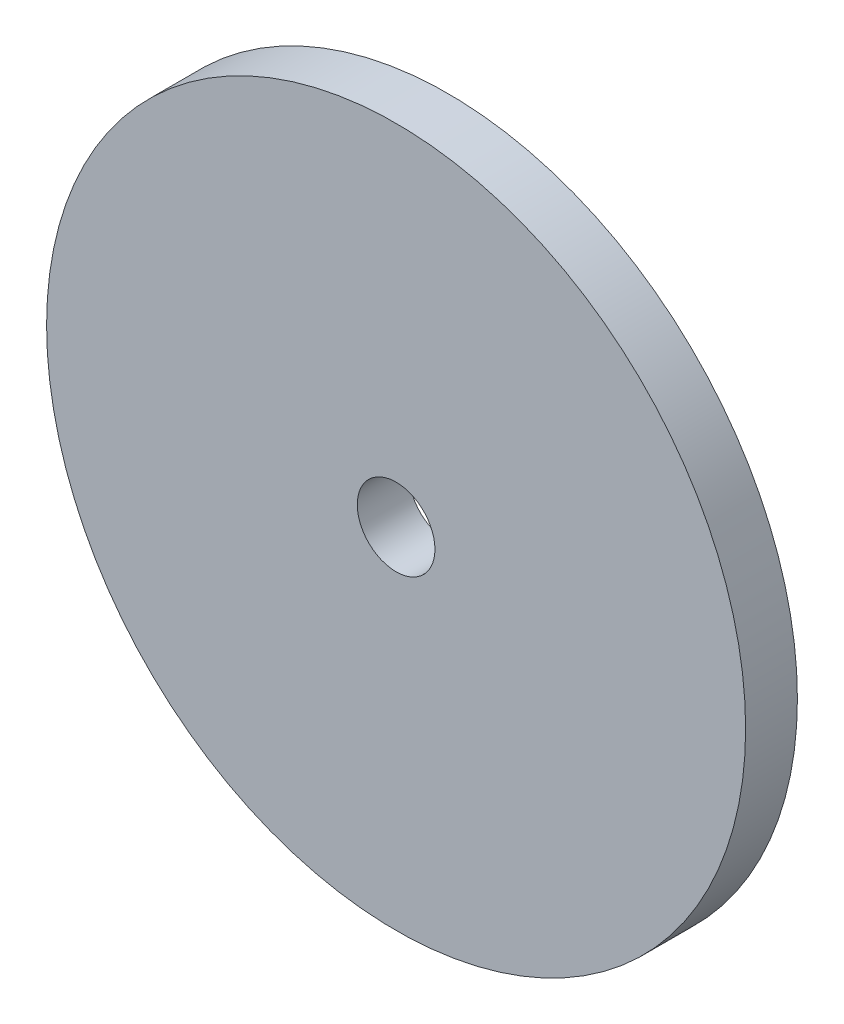
ISO-10303-21;
HEADER;
FILE_DESCRIPTION(('STEP AP214'),'2;1');
FILE_NAME('part.step','',(''),(''),'','','');
FILE_SCHEMA(('AUTOMOTIVE_DESIGN { 1 0 10303 214 1 1 1 1 }'));
ENDSEC;
DATA;
#1=APPLICATION_CONTEXT('core data for automotive mechanical design processes');
#2=APPLICATION_PROTOCOL_DEFINITION('international standard','automotive_design',2000,#1);
#3=PRODUCT_CONTEXT('',#1,'mechanical');
#4=PRODUCT('Part','Part','',(#3));
#5=PRODUCT_RELATED_PRODUCT_CATEGORY('part','',(#4));
#6=PRODUCT_DEFINITION_FORMATION('','',#4);
#7=PRODUCT_DEFINITION_CONTEXT('part definition',#1,'design');
#8=PRODUCT_DEFINITION('design','',#6,#7);
#9=PRODUCT_DEFINITION_SHAPE('','',#8);
#10=(LENGTH_UNIT() NAMED_UNIT(*) SI_UNIT(.MILLI.,.METRE.));
#11=(NAMED_UNIT(*) PLANE_ANGLE_UNIT() SI_UNIT($,.RADIAN.));
#12=(NAMED_UNIT(*) SI_UNIT($,.STERADIAN.) SOLID_ANGLE_UNIT());
#13=UNCERTAINTY_MEASURE_WITH_UNIT(LENGTH_MEASURE(1.E-05),#10,'distance_accuracy_value','');
#14=(GEOMETRIC_REPRESENTATION_CONTEXT(3) GLOBAL_UNCERTAINTY_ASSIGNED_CONTEXT((#13)) GLOBAL_UNIT_ASSIGNED_CONTEXT((#10,
#11,#12)) REPRESENTATION_CONTEXT('',''));
#15=CARTESIAN_POINT('',(0.,0.,0.));
#16=DIRECTION('',(0.,0.,1.));
#17=DIRECTION('',(1.,0.,0.));
#18=AXIS2_PLACEMENT_3D('',#15,#16,#17);
#19=CARTESIAN_POINT('',(0.,0.,2.));
#20=DIRECTION('',(0.,0.,1.));
#21=DIRECTION('',(1.,0.,0.));
#22=AXIS2_PLACEMENT_3D('',#19,#20,#21);
#23=PLANE('',#22);
#24=CARTESIAN_POINT('',(0.,0.,2.));
#25=DIRECTION('',(0.,0.,1.));
#26=DIRECTION('',(1.,0.,0.));
#27=AXIS2_PLACEMENT_3D('',#24,#25,#26);
#28=CIRCLE('',#27,13.5);
#29=CARTESIAN_POINT('',(13.5,0.,2.));
#30=VERTEX_POINT('',#29);
#31=EDGE_CURVE('E10',#30,#30,#28,.T.);
#32=ORIENTED_EDGE('',*,*,#31,.T.);
#33=EDGE_LOOP('',(#32));
#34=FACE_BOUND('',#33,.T.);
#35=CARTESIAN_POINT('',(0.,0.,2.));
#36=DIRECTION('',(0.,0.,1.));
#37=DIRECTION('',(1.,0.,0.));
#38=AXIS2_PLACEMENT_3D('',#35,#36,#37);
#39=CIRCLE('',#38,1.5);
#40=CARTESIAN_POINT('',(1.5,0.,2.));
#41=VERTEX_POINT('',#40);
#42=EDGE_CURVE('E43',#41,#41,#39,.T.);
#43=ORIENTED_EDGE('',*,*,#42,.F.);
#44=EDGE_LOOP('',(#43));
#45=FACE_BOUND('',#44,.T.);
#46=ADVANCED_FACE('F32',(#34,#45),#23,.T.);
#47=CARTESIAN_POINT('',(0.,0.,0.));
#48=DIRECTION('',(0.,0.,1.));
#49=DIRECTION('',(1.,0.,0.));
#50=AXIS2_PLACEMENT_3D('',#47,#48,#49);
#51=PLANE('',#50);
#52=CARTESIAN_POINT('',(0.,0.,0.));
#53=DIRECTION('',(0.,0.,1.));
#54=DIRECTION('',(1.,0.,0.));
#55=AXIS2_PLACEMENT_3D('',#52,#53,#54);
#56=CIRCLE('',#55,13.5);
#57=CARTESIAN_POINT('',(13.5,0.,0.));
#58=VERTEX_POINT('',#57);
#59=EDGE_CURVE('E36',#58,#58,#56,.T.);
#60=ORIENTED_EDGE('',*,*,#59,.F.);
#61=EDGE_LOOP('',(#60));
#62=FACE_BOUND('',#61,.T.);
#63=CARTESIAN_POINT('',(0.,0.,0.));
#64=DIRECTION('',(0.,0.,1.));
#65=DIRECTION('',(1.,0.,0.));
#66=AXIS2_PLACEMENT_3D('',#63,#64,#65);
#67=CIRCLE('',#66,1.5);
#68=CARTESIAN_POINT('',(1.5,0.,0.));
#69=VERTEX_POINT('',#68);
#70=EDGE_CURVE('E45',#69,#69,#67,.T.);
#71=ORIENTED_EDGE('',*,*,#70,.T.);
#72=EDGE_LOOP('',(#71));
#73=FACE_BOUND('',#72,.T.);
#74=ADVANCED_FACE('F55',(#62,#73),#51,.F.);
#75=CARTESIAN_POINT('',(0.,0.,2.));
#76=DIRECTION('',(0.,0.,-1.));
#77=DIRECTION('',(-1.,0.,0.));
#78=AXIS2_PLACEMENT_3D('',#75,#76,#77);
#79=CYLINDRICAL_SURFACE('',#78,13.5);
#80=ORIENTED_EDGE('',*,*,#31,.F.);
#81=EDGE_LOOP('',(#80));
#82=FACE_BOUND('',#81,.T.);
#83=ORIENTED_EDGE('',*,*,#59,.T.);
#84=EDGE_LOOP('',(#83));
#85=FACE_BOUND('',#84,.T.);
#86=ADVANCED_FACE('F34',(#82,#85),#79,.T.);
#87=CARTESIAN_POINT('',(0.,0.,2.));
#88=DIRECTION('',(0.,0.,-1.));
#89=DIRECTION('',(-1.,0.,0.));
#90=AXIS2_PLACEMENT_3D('',#87,#88,#89);
#91=CYLINDRICAL_SURFACE('',#90,1.5);
#92=ORIENTED_EDGE('',*,*,#42,.T.);
#93=EDGE_LOOP('',(#92));
#94=FACE_BOUND('',#93,.T.);
#95=ORIENTED_EDGE('',*,*,#70,.F.);
#96=EDGE_LOOP('',(#95));
#97=FACE_BOUND('',#96,.T.);
#98=ADVANCED_FACE('F51',(#94,#97),#91,.F.);
#99=CLOSED_SHELL('',(#46,#74,#86,#98));
#100=MANIFOLD_SOLID_BREP('B2',#99);
#101=ADVANCED_BREP_SHAPE_REPRESENTATION('',(#18,#100),#14);
#102=SHAPE_DEFINITION_REPRESENTATION(#9,#101);
ENDSEC;
END-ISO-10303-21;
